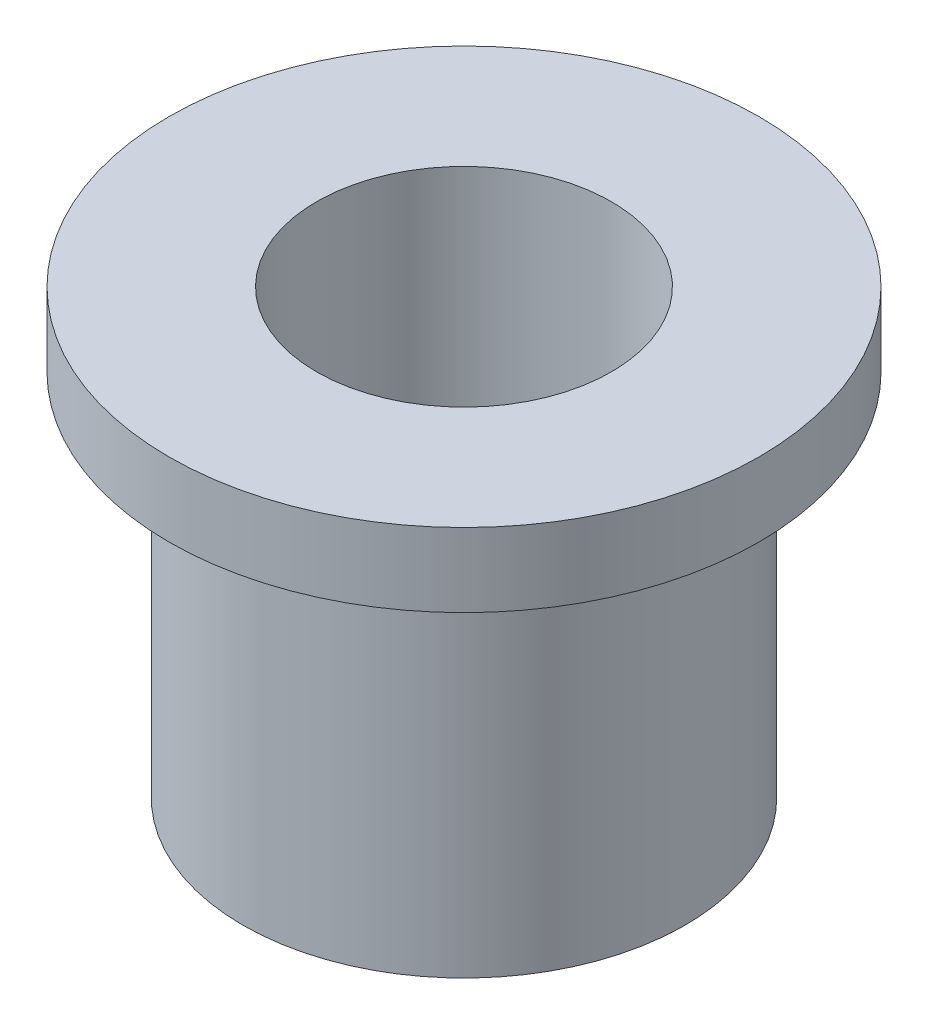
ISO-10303-21;
HEADER;
FILE_DESCRIPTION(('STEP AP214'),'2;1');
FILE_NAME('part.step','',(''),(''),'','','');
FILE_SCHEMA(('AUTOMOTIVE_DESIGN { 1 0 10303 214 1 1 1 1 }'));
ENDSEC;
DATA;
#1=APPLICATION_CONTEXT('core data for automotive mechanical design processes');
#2=APPLICATION_PROTOCOL_DEFINITION('international standard','automotive_design',2000,#1);
#3=PRODUCT_CONTEXT('',#1,'mechanical');
#4=PRODUCT('Part','Part','',(#3));
#5=PRODUCT_RELATED_PRODUCT_CATEGORY('part','',(#4));
#6=PRODUCT_DEFINITION_FORMATION('','',#4);
#7=PRODUCT_DEFINITION_CONTEXT('part definition',#1,'design');
#8=PRODUCT_DEFINITION('design','',#6,#7);
#9=PRODUCT_DEFINITION_SHAPE('','',#8);
#10=(LENGTH_UNIT() NAMED_UNIT(*) SI_UNIT(.MILLI.,.METRE.));
#11=(NAMED_UNIT(*) PLANE_ANGLE_UNIT() SI_UNIT($,.RADIAN.));
#12=(NAMED_UNIT(*) SI_UNIT($,.STERADIAN.) SOLID_ANGLE_UNIT());
#13=UNCERTAINTY_MEASURE_WITH_UNIT(LENGTH_MEASURE(1.E-05),#10,'distance_accuracy_value','');
#14=(GEOMETRIC_REPRESENTATION_CONTEXT(3) GLOBAL_UNCERTAINTY_ASSIGNED_CONTEXT((#13)) GLOBAL_UNIT_ASSIGNED_CONTEXT((#10,
#11,#12)) REPRESENTATION_CONTEXT('',''));
#15=CARTESIAN_POINT('',(0.,0.,0.));
#16=DIRECTION('',(0.,0.,1.));
#17=DIRECTION('',(1.,0.,0.));
#18=AXIS2_PLACEMENT_3D('',#15,#16,#17);
#19=CARTESIAN_POINT('',(6.34999999999999,0.,0.));
#20=DIRECTION('',(0.,-1.,0.));
#21=DIRECTION('',(0.,0.,-1.));
#22=AXIS2_PLACEMENT_3D('',#19,#20,#21);
#23=PLANE('',#22);
#24=CARTESIAN_POINT('',(0.,0.,0.));
#25=DIRECTION('',(0.,1.,0.));
#26=DIRECTION('',(0.,0.,1.));
#27=AXIS2_PLACEMENT_3D('',#24,#25,#26);
#28=CIRCLE('',#27,3.175);
#29=CARTESIAN_POINT('',(0.,0.,3.175));
#30=VERTEX_POINT('',#29);
#31=EDGE_CURVE('E10',#30,#30,#28,.T.);
#32=ORIENTED_EDGE('',*,*,#31,.F.);
#33=EDGE_LOOP('',(#32));
#34=FACE_BOUND('',#33,.T.);
#35=CARTESIAN_POINT('',(0.,0.,0.));
#36=DIRECTION('',(0.,1.,0.));
#37=DIRECTION('',(0.,0.,1.));
#38=AXIS2_PLACEMENT_3D('',#35,#36,#37);
#39=CIRCLE('',#38,6.35);
#40=CARTESIAN_POINT('',(0.,0.,6.35));
#41=VERTEX_POINT('',#40);
#42=EDGE_CURVE('E50',#41,#41,#39,.T.);
#43=ORIENTED_EDGE('',*,*,#42,.T.);
#44=EDGE_LOOP('',(#43));
#45=FACE_BOUND('',#44,.T.);
#46=ADVANCED_FACE('F28',(#34,#45),#23,.F.);
#47=CARTESIAN_POINT('',(0.,0.,0.));
#48=DIRECTION('',(0.,1.,0.));
#49=DIRECTION('',(0.,0.,1.));
#50=AXIS2_PLACEMENT_3D('',#47,#48,#49);
#51=CYLINDRICAL_SURFACE('',#50,3.175);
#52=CARTESIAN_POINT('',(0.,-9.52500000000001,0.));
#53=DIRECTION('',(0.,1.,0.));
#54=DIRECTION('',(0.,0.,1.));
#55=AXIS2_PLACEMENT_3D('',#52,#53,#54);
#56=CIRCLE('',#55,3.175);
#57=CARTESIAN_POINT('',(0.,-9.52500000000001,3.175));
#58=VERTEX_POINT('',#57);
#59=EDGE_CURVE('E34',#58,#58,#56,.T.);
#60=ORIENTED_EDGE('',*,*,#59,.F.);
#61=EDGE_LOOP('',(#60));
#62=FACE_BOUND('',#61,.T.);
#63=ORIENTED_EDGE('',*,*,#31,.T.);
#64=EDGE_LOOP('',(#63));
#65=FACE_BOUND('',#64,.T.);
#66=ADVANCED_FACE('F75',(#62,#65),#51,.F.);
#67=CARTESIAN_POINT('',(3.17500000000001,-9.52500000000001,0.));
#68=DIRECTION('',(0.,1.,0.));
#69=DIRECTION('',(0.,0.,1.));
#70=AXIS2_PLACEMENT_3D('',#67,#68,#69);
#71=PLANE('',#70);
#72=CARTESIAN_POINT('',(0.,-9.52500000000001,0.));
#73=DIRECTION('',(0.,1.,0.));
#74=DIRECTION('',(0.,0.,1.));
#75=AXIS2_PLACEMENT_3D('',#72,#73,#74);
#76=CIRCLE('',#75,4.7625);
#77=CARTESIAN_POINT('',(0.,-9.52500000000001,4.7625));
#78=VERTEX_POINT('',#77);
#79=EDGE_CURVE('E38',#78,#78,#76,.T.);
#80=ORIENTED_EDGE('',*,*,#79,.F.);
#81=EDGE_LOOP('',(#80));
#82=FACE_BOUND('',#81,.T.);
#83=ORIENTED_EDGE('',*,*,#59,.T.);
#84=EDGE_LOOP('',(#83));
#85=FACE_BOUND('',#84,.T.);
#86=ADVANCED_FACE('F70',(#82,#85),#71,.F.);
#87=CARTESIAN_POINT('',(0.,0.,0.));
#88=DIRECTION('',(0.,1.,0.));
#89=DIRECTION('',(0.,0.,1.));
#90=AXIS2_PLACEMENT_3D('',#87,#88,#89);
#91=CYLINDRICAL_SURFACE('',#90,4.7625);
#92=CARTESIAN_POINT('',(0.,-1.58749999999996,0.));
#93=DIRECTION('',(0.,1.,0.));
#94=DIRECTION('',(0.,0.,1.));
#95=AXIS2_PLACEMENT_3D('',#92,#93,#94);
#96=CIRCLE('',#95,4.7625);
#97=CARTESIAN_POINT('',(0.,-1.58749999999996,4.7625));
#98=VERTEX_POINT('',#97);
#99=EDGE_CURVE('E42',#98,#98,#96,.T.);
#100=ORIENTED_EDGE('',*,*,#99,.F.);
#101=EDGE_LOOP('',(#100));
#102=FACE_BOUND('',#101,.T.);
#103=ORIENTED_EDGE('',*,*,#79,.T.);
#104=EDGE_LOOP('',(#103));
#105=FACE_BOUND('',#104,.T.);
#106=ADVANCED_FACE('F64',(#102,#105),#91,.T.);
#107=CARTESIAN_POINT('',(4.7625,-1.58749999999996,0.));
#108=DIRECTION('',(0.,1.,0.));
#109=DIRECTION('',(0.,0.,1.));
#110=AXIS2_PLACEMENT_3D('',#107,#108,#109);
#111=PLANE('',#110);
#112=CARTESIAN_POINT('',(0.,-1.58749999999996,0.));
#113=DIRECTION('',(0.,1.,0.));
#114=DIRECTION('',(0.,0.,1.));
#115=AXIS2_PLACEMENT_3D('',#112,#113,#114);
#116=CIRCLE('',#115,6.35);
#117=CARTESIAN_POINT('',(0.,-1.58749999999996,6.35));
#118=VERTEX_POINT('',#117);
#119=EDGE_CURVE('E47',#118,#118,#116,.T.);
#120=ORIENTED_EDGE('',*,*,#119,.F.);
#121=EDGE_LOOP('',(#120));
#122=FACE_BOUND('',#121,.T.);
#123=ORIENTED_EDGE('',*,*,#99,.T.);
#124=EDGE_LOOP('',(#123));
#125=FACE_BOUND('',#124,.T.);
#126=ADVANCED_FACE('F58',(#122,#125),#111,.F.);
#127=CARTESIAN_POINT('',(0.,0.,0.));
#128=DIRECTION('',(0.,1.,0.));
#129=DIRECTION('',(0.,0.,1.));
#130=AXIS2_PLACEMENT_3D('',#127,#128,#129);
#131=CYLINDRICAL_SURFACE('',#130,6.35);
#132=ORIENTED_EDGE('',*,*,#42,.F.);
#133=EDGE_LOOP('',(#132));
#134=FACE_BOUND('',#133,.T.);
#135=ORIENTED_EDGE('',*,*,#119,.T.);
#136=EDGE_LOOP('',(#135));
#137=FACE_BOUND('',#136,.T.);
#138=ADVANCED_FACE('F55',(#134,#137),#131,.T.);
#139=CLOSED_SHELL('',(#46,#66,#86,#106,#126,#138));
#140=MANIFOLD_SOLID_BREP('B2',#139);
#141=ADVANCED_BREP_SHAPE_REPRESENTATION('',(#18,#140),#14);
#142=SHAPE_DEFINITION_REPRESENTATION(#9,#141);
ENDSEC;
END-ISO-10303-21;
